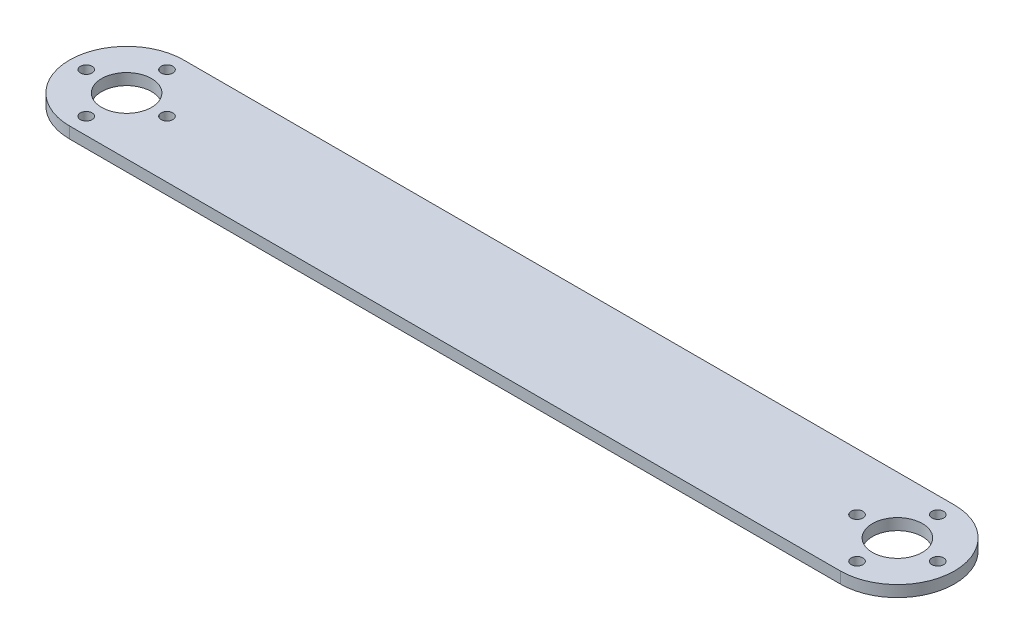
ISO-10303-21;
HEADER;
FILE_DESCRIPTION(('STEP AP214'),'2;1');
FILE_NAME('part.step','',(''),(''),'','','');
FILE_SCHEMA(('AUTOMOTIVE_DESIGN { 1 0 10303 214 1 1 1 1 }'));
ENDSEC;
DATA;
#1=APPLICATION_CONTEXT('core data for automotive mechanical design processes');
#2=APPLICATION_PROTOCOL_DEFINITION('international standard','automotive_design',2000,#1);
#3=PRODUCT_CONTEXT('',#1,'mechanical');
#4=PRODUCT('Part','Part','',(#3));
#5=PRODUCT_RELATED_PRODUCT_CATEGORY('part','',(#4));
#6=PRODUCT_DEFINITION_FORMATION('','',#4);
#7=PRODUCT_DEFINITION_CONTEXT('part definition',#1,'design');
#8=PRODUCT_DEFINITION('design','',#6,#7);
#9=PRODUCT_DEFINITION_SHAPE('','',#8);
#10=(LENGTH_UNIT() NAMED_UNIT(*) SI_UNIT(.MILLI.,.METRE.));
#11=(NAMED_UNIT(*) PLANE_ANGLE_UNIT() SI_UNIT($,.RADIAN.));
#12=(NAMED_UNIT(*) SI_UNIT($,.STERADIAN.) SOLID_ANGLE_UNIT());
#13=UNCERTAINTY_MEASURE_WITH_UNIT(LENGTH_MEASURE(1.E-05),#10,'distance_accuracy_value','');
#14=(GEOMETRIC_REPRESENTATION_CONTEXT(3) GLOBAL_UNCERTAINTY_ASSIGNED_CONTEXT((#13)) GLOBAL_UNIT_ASSIGNED_CONTEXT((#10,
#11,#12)) REPRESENTATION_CONTEXT('',''));
#15=CARTESIAN_POINT('',(0.,0.,0.));
#16=DIRECTION('',(0.,0.,1.));
#17=DIRECTION('',(1.,0.,0.));
#18=AXIS2_PLACEMENT_3D('',#15,#16,#17);
#19=CARTESIAN_POINT('',(0.,3.175,0.));
#20=DIRECTION('',(0.,1.,0.));
#21=DIRECTION('',(0.,0.,1.));
#22=AXIS2_PLACEMENT_3D('',#19,#20,#21);
#23=PLANE('',#22);
#24=CARTESIAN_POINT('',(216.,3.175,-27.3137084989848));
#25=DIRECTION('',(0.,1.,0.));
#26=DIRECTION('',(0.,0.,1.));
#27=AXIS2_PLACEMENT_3D('',#24,#25,#26);
#28=CIRCLE('',#27,1.65000000000002);
#29=CARTESIAN_POINT('',(216.,3.175,-25.6637084989847));
#30=VERTEX_POINT('',#29);
#31=EDGE_CURVE('E218',#30,#30,#28,.F.);
#32=ORIENTED_EDGE('',*,*,#31,.T.);
#33=EDGE_LOOP('',(#32));
#34=FACE_BOUND('',#33,.T.);
#35=CARTESIAN_POINT('',(216.,3.175,-4.68629150101524));
#36=DIRECTION('',(0.,-1.,0.));
#37=DIRECTION('',(0.,0.,-1.));
#38=AXIS2_PLACEMENT_3D('',#35,#36,#37);
#39=CIRCLE('',#38,1.65000000000002);
#40=CARTESIAN_POINT('',(216.,3.175,-6.33629150101525));
#41=VERTEX_POINT('',#40);
#42=EDGE_CURVE('E265',#41,#41,#39,.T.);
#43=ORIENTED_EDGE('',*,*,#42,.T.);
#44=EDGE_LOOP('',(#43));
#45=FACE_BOUND('',#44,.T.);
#46=CARTESIAN_POINT('',(227.313708498985,3.175,-16.));
#47=DIRECTION('',(0.,-1.,0.));
#48=DIRECTION('',(0.,0.,-1.));
#49=AXIS2_PLACEMENT_3D('',#46,#47,#48);
#50=CIRCLE('',#49,1.64999999999999);
#51=CARTESIAN_POINT('',(227.313708498985,3.175,-17.65));
#52=VERTEX_POINT('',#51);
#53=EDGE_CURVE('E268',#52,#52,#50,.T.);
#54=ORIENTED_EDGE('',*,*,#53,.T.);
#55=EDGE_LOOP('',(#54));
#56=FACE_BOUND('',#55,.T.);
#57=CARTESIAN_POINT('',(204.686291501015,3.175,-16.));
#58=DIRECTION('',(0.,1.,0.));
#59=DIRECTION('',(0.,0.,1.));
#60=AXIS2_PLACEMENT_3D('',#57,#58,#59);
#61=CIRCLE('',#60,1.64999999999999);
#62=CARTESIAN_POINT('',(204.686291501015,3.175,-14.35));
#63=VERTEX_POINT('',#62);
#64=EDGE_CURVE('E127',#63,#63,#61,.F.);
#65=ORIENTED_EDGE('',*,*,#64,.T.);
#66=EDGE_LOOP('',(#65));
#67=FACE_BOUND('',#66,.T.);
#68=CARTESIAN_POINT('',(216.,3.175,-16.));
#69=DIRECTION('',(0.,1.,0.));
#70=DIRECTION('',(0.,0.,1.));
#71=AXIS2_PLACEMENT_3D('',#68,#69,#70);
#72=CIRCLE('',#71,16.);
#73=CARTESIAN_POINT('',(216.,3.175,-32.));
#74=VERTEX_POINT('',#73);
#75=CARTESIAN_POINT('',(216.,3.175,0.));
#76=VERTEX_POINT('',#75);
#77=EDGE_CURVE('E96',#74,#76,#72,.F.);
#78=ORIENTED_EDGE('',*,*,#77,.F.);
#79=DIRECTION('',(1.,0.,0.));
#80=VECTOR('',#79,1.);
#81=CARTESIAN_POINT('',(0.,3.175,-32.));
#82=LINE('',#81,#80);
#83=CARTESIAN_POINT('',(0.,3.175,-32.));
#84=VERTEX_POINT('',#83);
#85=EDGE_CURVE('E87',#84,#74,#82,.T.);
#86=ORIENTED_EDGE('',*,*,#85,.F.);
#87=CARTESIAN_POINT('',(0.,3.175,-16.));
#88=DIRECTION('',(0.,1.,0.));
#89=DIRECTION('',(0.,0.,1.));
#90=AXIS2_PLACEMENT_3D('',#87,#88,#89);
#91=CIRCLE('',#90,16.);
#92=CARTESIAN_POINT('',(0.,3.175,0.));
#93=VERTEX_POINT('',#92);
#94=EDGE_CURVE('E92',#84,#93,#91,.T.);
#95=ORIENTED_EDGE('',*,*,#94,.T.);
#96=DIRECTION('',(1.,0.,0.));
#97=VECTOR('',#96,1.);
#98=CARTESIAN_POINT('',(0.,3.175,0.));
#99=LINE('',#98,#97);
#100=EDGE_CURVE('E54',#93,#76,#99,.T.);
#101=ORIENTED_EDGE('',*,*,#100,.T.);
#102=EDGE_LOOP('',(#78,#86,#95,#101));
#103=FACE_BOUND('',#102,.T.);
#104=CARTESIAN_POINT('',(216.,3.175,-16.));
#105=DIRECTION('',(0.,1.,0.));
#106=DIRECTION('',(0.,0.,1.));
#107=AXIS2_PLACEMENT_3D('',#104,#105,#106);
#108=CIRCLE('',#107,7.00000000000001);
#109=CARTESIAN_POINT('',(216.,3.175,-8.99999999999999));
#110=VERTEX_POINT('',#109);
#111=EDGE_CURVE('E103',#110,#110,#108,.T.);
#112=ORIENTED_EDGE('',*,*,#111,.F.);
#113=EDGE_LOOP('',(#112));
#114=FACE_BOUND('',#113,.T.);
#115=CARTESIAN_POINT('',(0.,3.175,-16.));
#116=DIRECTION('',(0.,1.,0.));
#117=DIRECTION('',(0.,0.,1.));
#118=AXIS2_PLACEMENT_3D('',#115,#116,#117);
#119=CIRCLE('',#118,7.);
#120=CARTESIAN_POINT('',(0.,3.175,-9.));
#121=VERTEX_POINT('',#120);
#122=EDGE_CURVE('E106',#121,#121,#119,.T.);
#123=ORIENTED_EDGE('',*,*,#122,.F.);
#124=EDGE_LOOP('',(#123));
#125=FACE_BOUND('',#124,.T.);
#126=CARTESIAN_POINT('',(0.,3.175,-4.68629150101524));
#127=DIRECTION('',(0.,1.,0.));
#128=DIRECTION('',(0.,0.,1.));
#129=AXIS2_PLACEMENT_3D('',#126,#127,#128);
#130=CIRCLE('',#129,1.65);
#131=CARTESIAN_POINT('',(0.,3.175,-3.03629150101524));
#132=VERTEX_POINT('',#131);
#133=EDGE_CURVE('E256',#132,#132,#130,.T.);
#134=ORIENTED_EDGE('',*,*,#133,.F.);
#135=EDGE_LOOP('',(#134));
#136=FACE_BOUND('',#135,.T.);
#137=CARTESIAN_POINT('',(-11.3137084989848,3.175,-16.));
#138=DIRECTION('',(0.,1.,0.));
#139=DIRECTION('',(0.,0.,1.));
#140=AXIS2_PLACEMENT_3D('',#137,#138,#139);
#141=CIRCLE('',#140,1.65);
#142=CARTESIAN_POINT('',(-11.3137084989848,3.175,-14.35));
#143=VERTEX_POINT('',#142);
#144=EDGE_CURVE('E216',#143,#143,#141,.T.);
#145=ORIENTED_EDGE('',*,*,#144,.F.);
#146=EDGE_LOOP('',(#145));
#147=FACE_BOUND('',#146,.T.);
#148=CARTESIAN_POINT('',(0.,3.175,-27.3137084989848));
#149=DIRECTION('',(0.,1.,0.));
#150=DIRECTION('',(0.,0.,1.));
#151=AXIS2_PLACEMENT_3D('',#148,#149,#150);
#152=CIRCLE('',#151,1.65);
#153=CARTESIAN_POINT('',(0.,3.175,-25.6637084989848));
#154=VERTEX_POINT('',#153);
#155=EDGE_CURVE('E219',#154,#154,#152,.T.);
#156=ORIENTED_EDGE('',*,*,#155,.F.);
#157=EDGE_LOOP('',(#156));
#158=FACE_BOUND('',#157,.T.);
#159=CARTESIAN_POINT('',(11.3137084989848,3.175,-16.));
#160=DIRECTION('',(0.,1.,0.));
#161=DIRECTION('',(0.,0.,1.));
#162=AXIS2_PLACEMENT_3D('',#159,#160,#161);
#163=CIRCLE('',#162,1.65);
#164=CARTESIAN_POINT('',(11.3137084989848,3.175,-14.35));
#165=VERTEX_POINT('',#164);
#166=EDGE_CURVE('E223',#165,#165,#163,.T.);
#167=ORIENTED_EDGE('',*,*,#166,.F.);
#168=EDGE_LOOP('',(#167));
#169=FACE_BOUND('',#168,.T.);
#170=ADVANCED_FACE('F35',(#34,#45,#56,#67,#103,#114,#125,#136,#147,#158,#169),#23,.T.);
#171=CARTESIAN_POINT('',(0.,0.,0.));
#172=DIRECTION('',(0.,1.,0.));
#173=DIRECTION('',(0.,0.,1.));
#174=AXIS2_PLACEMENT_3D('',#171,#172,#173);
#175=PLANE('',#174);
#176=CARTESIAN_POINT('',(0.,0.,-27.3137084989848));
#177=DIRECTION('',(0.,1.,0.));
#178=DIRECTION('',(0.,0.,1.));
#179=AXIS2_PLACEMENT_3D('',#176,#177,#178);
#180=CIRCLE('',#179,1.65);
#181=CARTESIAN_POINT('',(0.,0.,-25.6637084989848));
#182=VERTEX_POINT('',#181);
#183=EDGE_CURVE('E141',#182,#182,#180,.T.);
#184=ORIENTED_EDGE('',*,*,#183,.T.);
#185=EDGE_LOOP('',(#184));
#186=FACE_BOUND('',#185,.T.);
#187=CARTESIAN_POINT('',(0.,0.,-4.68629150101524));
#188=DIRECTION('',(0.,1.,0.));
#189=DIRECTION('',(0.,0.,1.));
#190=AXIS2_PLACEMENT_3D('',#187,#188,#189);
#191=CIRCLE('',#190,1.65);
#192=CARTESIAN_POINT('',(0.,0.,-3.03629150101524));
#193=VERTEX_POINT('',#192);
#194=EDGE_CURVE('E133',#193,#193,#191,.T.);
#195=ORIENTED_EDGE('',*,*,#194,.T.);
#196=EDGE_LOOP('',(#195));
#197=FACE_BOUND('',#196,.T.);
#198=CARTESIAN_POINT('',(216.,0.,-4.68629150101524));
#199=DIRECTION('',(0.,1.,0.));
#200=DIRECTION('',(0.,0.,1.));
#201=AXIS2_PLACEMENT_3D('',#198,#199,#200);
#202=CIRCLE('',#201,1.65000000000002);
#203=CARTESIAN_POINT('',(216.,0.,-3.03629150101522));
#204=VERTEX_POINT('',#203);
#205=EDGE_CURVE('E130',#204,#204,#202,.F.);
#206=ORIENTED_EDGE('',*,*,#205,.F.);
#207=EDGE_LOOP('',(#206));
#208=FACE_BOUND('',#207,.T.);
#209=CARTESIAN_POINT('',(227.313708498985,0.,-16.));
#210=DIRECTION('',(0.,1.,0.));
#211=DIRECTION('',(0.,0.,1.));
#212=AXIS2_PLACEMENT_3D('',#209,#210,#211);
#213=CIRCLE('',#212,1.64999999999999);
#214=CARTESIAN_POINT('',(227.313708498985,0.,-14.35));
#215=VERTEX_POINT('',#214);
#216=EDGE_CURVE('E126',#215,#215,#213,.F.);
#217=ORIENTED_EDGE('',*,*,#216,.F.);
#218=EDGE_LOOP('',(#217));
#219=FACE_BOUND('',#218,.T.);
#220=CARTESIAN_POINT('',(204.686291501015,0.,-16.));
#221=DIRECTION('',(0.,1.,0.));
#222=DIRECTION('',(0.,0.,1.));
#223=AXIS2_PLACEMENT_3D('',#220,#221,#222);
#224=CIRCLE('',#223,1.64999999999999);
#225=CARTESIAN_POINT('',(204.686291501015,0.,-14.35));
#226=VERTEX_POINT('',#225);
#227=EDGE_CURVE('E123',#226,#226,#224,.F.);
#228=ORIENTED_EDGE('',*,*,#227,.F.);
#229=EDGE_LOOP('',(#228));
#230=FACE_BOUND('',#229,.T.);
#231=CARTESIAN_POINT('',(216.,0.,-16.));
#232=DIRECTION('',(0.,1.,0.));
#233=DIRECTION('',(0.,0.,1.));
#234=AXIS2_PLACEMENT_3D('',#231,#232,#233);
#235=CIRCLE('',#234,16.);
#236=CARTESIAN_POINT('',(216.,0.,-32.));
#237=VERTEX_POINT('',#236);
#238=CARTESIAN_POINT('',(216.,0.,0.));
#239=VERTEX_POINT('',#238);
#240=EDGE_CURVE('E109',#237,#239,#235,.F.);
#241=ORIENTED_EDGE('',*,*,#240,.T.);
#242=DIRECTION('',(1.,0.,0.));
#243=VECTOR('',#242,1.);
#244=CARTESIAN_POINT('',(0.,0.,0.));
#245=LINE('',#244,#243);
#246=CARTESIAN_POINT('',(0.,0.,0.));
#247=VERTEX_POINT('',#246);
#248=EDGE_CURVE('E114',#247,#239,#245,.T.);
#249=ORIENTED_EDGE('',*,*,#248,.F.);
#250=CARTESIAN_POINT('',(0.,0.,-16.));
#251=DIRECTION('',(0.,1.,0.));
#252=DIRECTION('',(0.,0.,1.));
#253=AXIS2_PLACEMENT_3D('',#250,#251,#252);
#254=CIRCLE('',#253,16.);
#255=CARTESIAN_POINT('',(0.,0.,-32.));
#256=VERTEX_POINT('',#255);
#257=EDGE_CURVE('E69',#256,#247,#254,.T.);
#258=ORIENTED_EDGE('',*,*,#257,.F.);
#259=DIRECTION('',(1.,0.,0.));
#260=VECTOR('',#259,1.);
#261=CARTESIAN_POINT('',(0.,0.,-32.));
#262=LINE('',#261,#260);
#263=EDGE_CURVE('E89',#256,#237,#262,.T.);
#264=ORIENTED_EDGE('',*,*,#263,.T.);
#265=EDGE_LOOP('',(#241,#249,#258,#264));
#266=FACE_BOUND('',#265,.T.);
#267=CARTESIAN_POINT('',(216.,0.,-16.));
#268=DIRECTION('',(0.,1.,0.));
#269=DIRECTION('',(0.,0.,1.));
#270=AXIS2_PLACEMENT_3D('',#267,#268,#269);
#271=CIRCLE('',#270,7.00000000000001);
#272=CARTESIAN_POINT('',(216.,0.,-8.99999999999999));
#273=VERTEX_POINT('',#272);
#274=EDGE_CURVE('E116',#273,#273,#271,.T.);
#275=ORIENTED_EDGE('',*,*,#274,.T.);
#276=EDGE_LOOP('',(#275));
#277=FACE_BOUND('',#276,.T.);
#278=CARTESIAN_POINT('',(0.,0.,-16.));
#279=DIRECTION('',(0.,1.,0.));
#280=DIRECTION('',(0.,0.,1.));
#281=AXIS2_PLACEMENT_3D('',#278,#279,#280);
#282=CIRCLE('',#281,7.);
#283=CARTESIAN_POINT('',(0.,0.,-9.));
#284=VERTEX_POINT('',#283);
#285=EDGE_CURVE('E98',#284,#284,#282,.T.);
#286=ORIENTED_EDGE('',*,*,#285,.T.);
#287=EDGE_LOOP('',(#286));
#288=FACE_BOUND('',#287,.T.);
#289=CARTESIAN_POINT('',(216.,0.,-27.3137084989848));
#290=DIRECTION('',(0.,1.,0.));
#291=DIRECTION('',(0.,0.,1.));
#292=AXIS2_PLACEMENT_3D('',#289,#290,#291);
#293=CIRCLE('',#292,1.65000000000002);
#294=CARTESIAN_POINT('',(216.,0.,-25.6637084989847));
#295=VERTEX_POINT('',#294);
#296=EDGE_CURVE('E136',#295,#295,#293,.F.);
#297=ORIENTED_EDGE('',*,*,#296,.F.);
#298=EDGE_LOOP('',(#297));
#299=FACE_BOUND('',#298,.T.);
#300=CARTESIAN_POINT('',(-11.3137084989848,0.,-16.));
#301=DIRECTION('',(0.,1.,0.));
#302=DIRECTION('',(0.,0.,1.));
#303=AXIS2_PLACEMENT_3D('',#300,#301,#302);
#304=CIRCLE('',#303,1.65);
#305=CARTESIAN_POINT('',(-11.3137084989848,0.,-14.35));
#306=VERTEX_POINT('',#305);
#307=EDGE_CURVE('E139',#306,#306,#304,.T.);
#308=ORIENTED_EDGE('',*,*,#307,.T.);
#309=EDGE_LOOP('',(#308));
#310=FACE_BOUND('',#309,.T.);
#311=CARTESIAN_POINT('',(11.3137084989848,0.,-16.));
#312=DIRECTION('',(0.,1.,0.));
#313=DIRECTION('',(0.,0.,1.));
#314=AXIS2_PLACEMENT_3D('',#311,#312,#313);
#315=CIRCLE('',#314,1.65);
#316=CARTESIAN_POINT('',(11.3137084989848,0.,-14.35));
#317=VERTEX_POINT('',#316);
#318=EDGE_CURVE('E39',#317,#317,#315,.T.);
#319=ORIENTED_EDGE('',*,*,#318,.T.);
#320=EDGE_LOOP('',(#319));
#321=FACE_BOUND('',#320,.T.);
#322=ADVANCED_FACE('F148',(#186,#197,#208,#219,#230,#266,#277,#288,#299,#310,#321),#175,.F.);
#323=CARTESIAN_POINT('',(216.,3.175,-16.));
#324=DIRECTION('',(0.,-1.,0.));
#325=DIRECTION('',(0.,0.,-1.));
#326=AXIS2_PLACEMENT_3D('',#323,#324,#325);
#327=CYLINDRICAL_SURFACE('',#326,16.);
#328=ORIENTED_EDGE('',*,*,#240,.F.);
#329=DIRECTION('',(0.,-1.,0.));
#330=VECTOR('',#329,1.);
#331=CARTESIAN_POINT('',(216.,3.175,-32.));
#332=LINE('',#331,#330);
#333=EDGE_CURVE('E11',#74,#237,#332,.T.);
#334=ORIENTED_EDGE('',*,*,#333,.F.);
#335=ORIENTED_EDGE('',*,*,#77,.T.);
#336=DIRECTION('',(0.,-1.,0.));
#337=VECTOR('',#336,1.);
#338=CARTESIAN_POINT('',(216.,3.175,0.));
#339=LINE('',#338,#337);
#340=EDGE_CURVE('E76',#76,#239,#339,.T.);
#341=ORIENTED_EDGE('',*,*,#340,.T.);
#342=EDGE_LOOP('',(#328,#334,#335,#341));
#343=FACE_BOUND('',#342,.T.);
#344=ADVANCED_FACE('F37',(#343),#327,.T.);
#345=CARTESIAN_POINT('',(0.,3.175,-32.));
#346=DIRECTION('',(0.,0.,-1.));
#347=DIRECTION('',(-1.,0.,0.));
#348=AXIS2_PLACEMENT_3D('',#345,#346,#347);
#349=PLANE('',#348);
#350=ORIENTED_EDGE('',*,*,#263,.F.);
#351=DIRECTION('',(0.,-1.,0.));
#352=VECTOR('',#351,1.);
#353=CARTESIAN_POINT('',(0.,3.175,-32.));
#354=LINE('',#353,#352);
#355=EDGE_CURVE('E45',#84,#256,#354,.T.);
#356=ORIENTED_EDGE('',*,*,#355,.F.);
#357=ORIENTED_EDGE('',*,*,#85,.T.);
#358=ORIENTED_EDGE('',*,*,#333,.T.);
#359=EDGE_LOOP('',(#350,#356,#357,#358));
#360=FACE_BOUND('',#359,.T.);
#361=ADVANCED_FACE('F85',(#360),#349,.T.);
#362=CARTESIAN_POINT('',(0.,3.175,-16.));
#363=DIRECTION('',(0.,-1.,0.));
#364=DIRECTION('',(0.,0.,-1.));
#365=AXIS2_PLACEMENT_3D('',#362,#363,#364);
#366=CYLINDRICAL_SURFACE('',#365,16.);
#367=ORIENTED_EDGE('',*,*,#257,.T.);
#368=DIRECTION('',(0.,-1.,0.));
#369=VECTOR('',#368,1.);
#370=CARTESIAN_POINT('',(0.,3.175,0.));
#371=LINE('',#370,#369);
#372=EDGE_CURVE('E90',#93,#247,#371,.T.);
#373=ORIENTED_EDGE('',*,*,#372,.F.);
#374=ORIENTED_EDGE('',*,*,#94,.F.);
#375=ORIENTED_EDGE('',*,*,#355,.T.);
#376=EDGE_LOOP('',(#367,#373,#374,#375));
#377=FACE_BOUND('',#376,.T.);
#378=ADVANCED_FACE('F93',(#377),#366,.T.);
#379=CARTESIAN_POINT('',(216.,3.175,-16.));
#380=DIRECTION('',(0.,-1.,0.));
#381=DIRECTION('',(0.,0.,-1.));
#382=AXIS2_PLACEMENT_3D('',#379,#380,#381);
#383=CYLINDRICAL_SURFACE('',#382,7.00000000000001);
#384=ORIENTED_EDGE('',*,*,#111,.T.);
#385=EDGE_LOOP('',(#384));
#386=FACE_BOUND('',#385,.T.);
#387=ORIENTED_EDGE('',*,*,#274,.F.);
#388=EDGE_LOOP('',(#387));
#389=FACE_BOUND('',#388,.T.);
#390=ADVANCED_FACE('F181',(#386,#389),#383,.F.);
#391=CARTESIAN_POINT('',(0.,3.175,0.));
#392=DIRECTION('',(0.,0.,-1.));
#393=DIRECTION('',(-1.,0.,0.));
#394=AXIS2_PLACEMENT_3D('',#391,#392,#393);
#395=PLANE('',#394);
#396=ORIENTED_EDGE('',*,*,#248,.T.);
#397=ORIENTED_EDGE('',*,*,#340,.F.);
#398=ORIENTED_EDGE('',*,*,#100,.F.);
#399=ORIENTED_EDGE('',*,*,#372,.T.);
#400=EDGE_LOOP('',(#396,#397,#398,#399));
#401=FACE_BOUND('',#400,.T.);
#402=ADVANCED_FACE('F179',(#401),#395,.F.);
#403=CARTESIAN_POINT('',(0.,3.175,-16.));
#404=DIRECTION('',(0.,-1.,0.));
#405=DIRECTION('',(0.,0.,-1.));
#406=AXIS2_PLACEMENT_3D('',#403,#404,#405);
#407=CYLINDRICAL_SURFACE('',#406,7.);
#408=ORIENTED_EDGE('',*,*,#122,.T.);
#409=EDGE_LOOP('',(#408));
#410=FACE_BOUND('',#409,.T.);
#411=ORIENTED_EDGE('',*,*,#285,.F.);
#412=EDGE_LOOP('',(#411));
#413=FACE_BOUND('',#412,.T.);
#414=ADVANCED_FACE('F176',(#410,#413),#407,.F.);
#415=CARTESIAN_POINT('',(204.686291501015,-6.825,-16.));
#416=DIRECTION('',(0.,1.,0.));
#417=DIRECTION('',(0.,0.,1.));
#418=AXIS2_PLACEMENT_3D('',#415,#416,#417);
#419=CYLINDRICAL_SURFACE('',#418,1.64999999999999);
#420=ORIENTED_EDGE('',*,*,#64,.F.);
#421=EDGE_LOOP('',(#420));
#422=FACE_BOUND('',#421,.T.);
#423=ORIENTED_EDGE('',*,*,#227,.T.);
#424=EDGE_LOOP('',(#423));
#425=FACE_BOUND('',#424,.T.);
#426=ADVANCED_FACE('F173',(#422,#425),#419,.F.);
#427=CARTESIAN_POINT('',(227.313708498985,-6.825,-16.));
#428=DIRECTION('',(0.,1.,0.));
#429=DIRECTION('',(0.,0.,1.));
#430=AXIS2_PLACEMENT_3D('',#427,#428,#429);
#431=CYLINDRICAL_SURFACE('',#430,1.64999999999999);
#432=ORIENTED_EDGE('',*,*,#53,.F.);
#433=EDGE_LOOP('',(#432));
#434=FACE_BOUND('',#433,.T.);
#435=ORIENTED_EDGE('',*,*,#216,.T.);
#436=EDGE_LOOP('',(#435));
#437=FACE_BOUND('',#436,.T.);
#438=ADVANCED_FACE('F232',(#434,#437),#431,.F.);
#439=CARTESIAN_POINT('',(216.,-6.825,-4.68629150101524));
#440=DIRECTION('',(0.,1.,0.));
#441=DIRECTION('',(0.,0.,1.));
#442=AXIS2_PLACEMENT_3D('',#439,#440,#441);
#443=CYLINDRICAL_SURFACE('',#442,1.65000000000002);
#444=ORIENTED_EDGE('',*,*,#42,.F.);
#445=EDGE_LOOP('',(#444));
#446=FACE_BOUND('',#445,.T.);
#447=ORIENTED_EDGE('',*,*,#205,.T.);
#448=EDGE_LOOP('',(#447));
#449=FACE_BOUND('',#448,.T.);
#450=ADVANCED_FACE('F238',(#446,#449),#443,.F.);
#451=CARTESIAN_POINT('',(0.,-6.825,-4.68629150101524));
#452=DIRECTION('',(0.,1.,0.));
#453=DIRECTION('',(0.,0.,1.));
#454=AXIS2_PLACEMENT_3D('',#451,#452,#453);
#455=CYLINDRICAL_SURFACE('',#454,1.65);
#456=ORIENTED_EDGE('',*,*,#133,.T.);
#457=EDGE_LOOP('',(#456));
#458=FACE_BOUND('',#457,.T.);
#459=ORIENTED_EDGE('',*,*,#194,.F.);
#460=EDGE_LOOP('',(#459));
#461=FACE_BOUND('',#460,.T.);
#462=ADVANCED_FACE('F212',(#458,#461),#455,.F.);
#463=CARTESIAN_POINT('',(216.,-6.825,-27.3137084989848));
#464=DIRECTION('',(0.,1.,0.));
#465=DIRECTION('',(0.,0.,1.));
#466=AXIS2_PLACEMENT_3D('',#463,#464,#465);
#467=CYLINDRICAL_SURFACE('',#466,1.65000000000002);
#468=ORIENTED_EDGE('',*,*,#31,.F.);
#469=EDGE_LOOP('',(#468));
#470=FACE_BOUND('',#469,.T.);
#471=ORIENTED_EDGE('',*,*,#296,.T.);
#472=EDGE_LOOP('',(#471));
#473=FACE_BOUND('',#472,.T.);
#474=ADVANCED_FACE('F207',(#470,#473),#467,.F.);
#475=CARTESIAN_POINT('',(-11.3137084989848,-6.825,-16.));
#476=DIRECTION('',(0.,1.,0.));
#477=DIRECTION('',(0.,0.,1.));
#478=AXIS2_PLACEMENT_3D('',#475,#476,#477);
#479=CYLINDRICAL_SURFACE('',#478,1.65);
#480=ORIENTED_EDGE('',*,*,#144,.T.);
#481=EDGE_LOOP('',(#480));
#482=FACE_BOUND('',#481,.T.);
#483=ORIENTED_EDGE('',*,*,#307,.F.);
#484=EDGE_LOOP('',(#483));
#485=FACE_BOUND('',#484,.T.);
#486=ADVANCED_FACE('F158',(#482,#485),#479,.F.);
#487=CARTESIAN_POINT('',(0.,-6.825,-27.3137084989848));
#488=DIRECTION('',(0.,1.,0.));
#489=DIRECTION('',(0.,0.,1.));
#490=AXIS2_PLACEMENT_3D('',#487,#488,#489);
#491=CYLINDRICAL_SURFACE('',#490,1.65);
#492=ORIENTED_EDGE('',*,*,#155,.T.);
#493=EDGE_LOOP('',(#492));
#494=FACE_BOUND('',#493,.T.);
#495=ORIENTED_EDGE('',*,*,#183,.F.);
#496=EDGE_LOOP('',(#495));
#497=FACE_BOUND('',#496,.T.);
#498=ADVANCED_FACE('F152',(#494,#497),#491,.F.);
#499=CARTESIAN_POINT('',(11.3137084989848,-6.825,-16.));
#500=DIRECTION('',(0.,1.,0.));
#501=DIRECTION('',(0.,0.,1.));
#502=AXIS2_PLACEMENT_3D('',#499,#500,#501);
#503=CYLINDRICAL_SURFACE('',#502,1.65);
#504=ORIENTED_EDGE('',*,*,#166,.T.);
#505=EDGE_LOOP('',(#504));
#506=FACE_BOUND('',#505,.T.);
#507=ORIENTED_EDGE('',*,*,#318,.F.);
#508=EDGE_LOOP('',(#507));
#509=FACE_BOUND('',#508,.T.);
#510=ADVANCED_FACE('F150',(#506,#509),#503,.F.);
#511=CLOSED_SHELL('',(#170,#322,#344,#361,#378,#390,#402,#414,#426,#438,#450,#462,#474,#486,
#498,#510));
#512=MANIFOLD_SOLID_BREP('B2',#511);
#513=ADVANCED_BREP_SHAPE_REPRESENTATION('',(#18,#512),#14);
#514=SHAPE_DEFINITION_REPRESENTATION(#9,#513);
ENDSEC;
END-ISO-10303-21;
